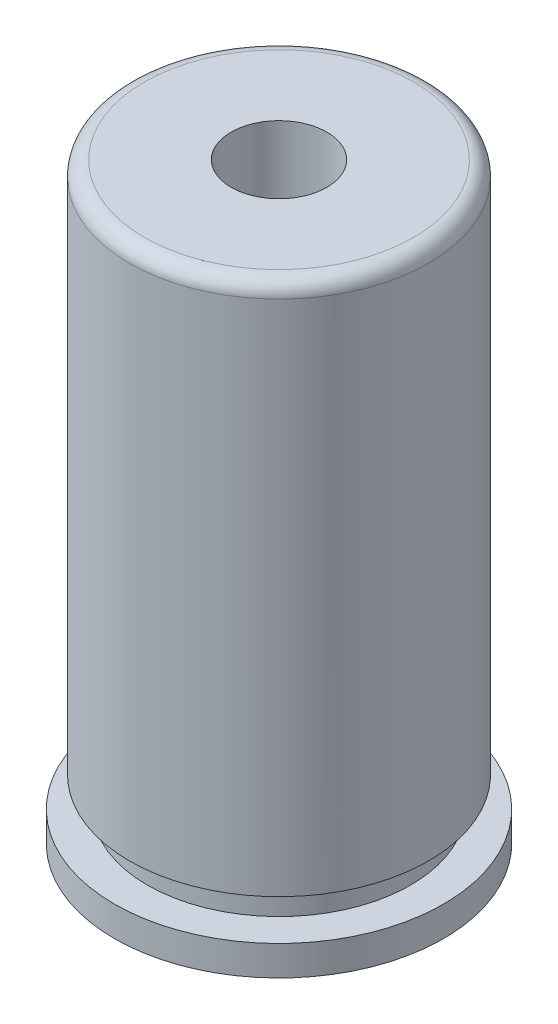
ISO-10303-21;
HEADER;
FILE_DESCRIPTION(('STEP AP214'),'2;1');
FILE_NAME('part.step','',(''),(''),'','','');
FILE_SCHEMA(('AUTOMOTIVE_DESIGN { 1 0 10303 214 1 1 1 1 }'));
ENDSEC;
DATA;
#1=APPLICATION_CONTEXT('core data for automotive mechanical design processes');
#2=APPLICATION_PROTOCOL_DEFINITION('international standard','automotive_design',2000,#1);
#3=PRODUCT_CONTEXT('',#1,'mechanical');
#4=PRODUCT('Part','Part','',(#3));
#5=PRODUCT_RELATED_PRODUCT_CATEGORY('part','',(#4));
#6=PRODUCT_DEFINITION_FORMATION('','',#4);
#7=PRODUCT_DEFINITION_CONTEXT('part definition',#1,'design');
#8=PRODUCT_DEFINITION('design','',#6,#7);
#9=PRODUCT_DEFINITION_SHAPE('','',#8);
#10=(LENGTH_UNIT() NAMED_UNIT(*) SI_UNIT(.MILLI.,.METRE.));
#11=(NAMED_UNIT(*) PLANE_ANGLE_UNIT() SI_UNIT($,.RADIAN.));
#12=(NAMED_UNIT(*) SI_UNIT($,.STERADIAN.) SOLID_ANGLE_UNIT());
#13=UNCERTAINTY_MEASURE_WITH_UNIT(LENGTH_MEASURE(1.E-05),#10,'distance_accuracy_value','');
#14=(GEOMETRIC_REPRESENTATION_CONTEXT(3) GLOBAL_UNCERTAINTY_ASSIGNED_CONTEXT((#13)) GLOBAL_UNIT_ASSIGNED_CONTEXT((#10,
#11,#12)) REPRESENTATION_CONTEXT('',''));
#15=CARTESIAN_POINT('',(0.,0.,0.));
#16=DIRECTION('',(0.,0.,1.));
#17=DIRECTION('',(1.,0.,0.));
#18=AXIS2_PLACEMENT_3D('',#15,#16,#17);
#19=CARTESIAN_POINT('',(0.,0.,0.));
#20=DIRECTION('',(0.,1.,0.));
#21=DIRECTION('',(0.,0.,1.));
#22=AXIS2_PLACEMENT_3D('',#19,#20,#21);
#23=PLANE('',#22);
#24=CARTESIAN_POINT('',(0.,0.,0.));
#25=DIRECTION('',(0.,-1.,0.));
#26=DIRECTION('',(0.,0.,-1.));
#27=AXIS2_PLACEMENT_3D('',#24,#25,#26);
#28=CIRCLE('',#27,2.75);
#29=CARTESIAN_POINT('',(0.,0.,-2.75));
#30=VERTEX_POINT('',#29);
#31=EDGE_CURVE('E132',#30,#30,#28,.F.);
#32=ORIENTED_EDGE('',*,*,#31,.F.);
#33=EDGE_LOOP('',(#32));
#34=FACE_BOUND('',#33,.T.);
#35=ADVANCED_FACE('F17',(#34),#23,.F.);
#36=CARTESIAN_POINT('',(0.,0.,0.));
#37=DIRECTION('',(0.,-1.,0.));
#38=DIRECTION('',(0.,0.,-1.));
#39=AXIS2_PLACEMENT_3D('',#36,#37,#38);
#40=CYLINDRICAL_SURFACE('',#39,2.75);
#41=CARTESIAN_POINT('',(0.,0.5,0.));
#42=DIRECTION('',(0.,-1.,0.));
#43=DIRECTION('',(0.,0.,-1.));
#44=AXIS2_PLACEMENT_3D('',#41,#42,#43);
#45=CIRCLE('',#44,2.75);
#46=CARTESIAN_POINT('',(0.,0.5,-2.75));
#47=VERTEX_POINT('',#46);
#48=EDGE_CURVE('E130',#47,#47,#45,.T.);
#49=ORIENTED_EDGE('',*,*,#48,.T.);
#50=EDGE_LOOP('',(#49));
#51=FACE_BOUND('',#50,.T.);
#52=ORIENTED_EDGE('',*,*,#31,.T.);
#53=EDGE_LOOP('',(#52));
#54=FACE_BOUND('',#53,.T.);
#55=ADVANCED_FACE('F92',(#51,#54),#40,.T.);
#56=CARTESIAN_POINT('',(0.,4.99999999999545,0.));
#57=DIRECTION('',(0.,1.,0.));
#58=DIRECTION('',(0.,0.,1.));
#59=AXIS2_PLACEMENT_3D('',#56,#57,#58);
#60=CONICAL_SURFACE('',#59,0.800000000026557,1.02974425866803);
#61=CARTESIAN_POINT('',(-8.5265128291212E-11,4.51931150479368,0.));
#62=VERTEX_POINT('',#61);
#63=VERTEX_LOOP('',#62);
#64=FACE_BOUND('',#63,.T.);
#65=CARTESIAN_POINT('',(0.,5.,0.));
#66=DIRECTION('',(0.,1.,0.));
#67=DIRECTION('',(0.,0.,1.));
#68=AXIS2_PLACEMENT_3D('',#65,#66,#67);
#69=CIRCLE('',#68,0.8);
#70=CARTESIAN_POINT('',(0.,5.,0.8));
#71=VERTEX_POINT('',#70);
#72=EDGE_CURVE('E129',#71,#71,#69,.T.);
#73=ORIENTED_EDGE('',*,*,#72,.T.);
#74=EDGE_LOOP('',(#73));
#75=FACE_BOUND('',#74,.T.);
#76=ADVANCED_FACE('F89',(#64,#75),#60,.F.);
#77=CARTESIAN_POINT('',(0.,0.5,0.));
#78=DIRECTION('',(0.,-1.,0.));
#79=DIRECTION('',(0.,0.,-1.));
#80=AXIS2_PLACEMENT_3D('',#77,#78,#79);
#81=PLANE('',#80);
#82=CARTESIAN_POINT('',(0.,0.5,0.));
#83=DIRECTION('',(0.,-1.,0.));
#84=DIRECTION('',(0.,0.,-1.));
#85=AXIS2_PLACEMENT_3D('',#82,#83,#84);
#86=CIRCLE('',#85,2.2);
#87=CARTESIAN_POINT('',(0.,0.5,-2.2));
#88=VERTEX_POINT('',#87);
#89=EDGE_CURVE('E120',#88,#88,#86,.F.);
#90=ORIENTED_EDGE('',*,*,#89,.F.);
#91=EDGE_LOOP('',(#90));
#92=FACE_BOUND('',#91,.T.);
#93=ORIENTED_EDGE('',*,*,#48,.F.);
#94=EDGE_LOOP('',(#93));
#95=FACE_BOUND('',#94,.T.);
#96=ADVANCED_FACE('F85',(#92,#95),#81,.F.);
#97=CARTESIAN_POINT('',(0.,4.245277080017,0.));
#98=DIRECTION('',(0.,1.,0.));
#99=DIRECTION('',(0.,0.,1.));
#100=AXIS2_PLACEMENT_3D('',#97,#98,#99);
#101=CYLINDRICAL_SURFACE('',#100,0.8);
#102=ORIENTED_EDGE('',*,*,#72,.F.);
#103=EDGE_LOOP('',(#102));
#104=FACE_BOUND('',#103,.T.);
#105=CARTESIAN_POINT('',(0.,9.9,0.));
#106=DIRECTION('',(0.,1.,0.));
#107=DIRECTION('',(0.,0.,1.));
#108=AXIS2_PLACEMENT_3D('',#105,#106,#107);
#109=CIRCLE('',#108,0.8);
#110=CARTESIAN_POINT('',(0.,9.9,0.8));
#111=VERTEX_POINT('',#110);
#112=EDGE_CURVE('E116',#111,#111,#109,.F.);
#113=ORIENTED_EDGE('',*,*,#112,.F.);
#114=EDGE_LOOP('',(#113));
#115=FACE_BOUND('',#114,.T.);
#116=ADVANCED_FACE('F81',(#104,#115),#101,.F.);
#117=CARTESIAN_POINT('',(0.,1.025,0.));
#118=DIRECTION('',(0.,-1.,0.));
#119=DIRECTION('',(0.,0.,-1.));
#120=AXIS2_PLACEMENT_3D('',#117,#118,#119);
#121=CYLINDRICAL_SURFACE('',#120,2.2);
#122=ORIENTED_EDGE('',*,*,#89,.T.);
#123=EDGE_LOOP('',(#122));
#124=FACE_BOUND('',#123,.T.);
#125=CARTESIAN_POINT('',(0.,1.,0.));
#126=DIRECTION('',(0.,-1.,0.));
#127=DIRECTION('',(0.,0.,-1.));
#128=AXIS2_PLACEMENT_3D('',#125,#126,#127);
#129=CIRCLE('',#128,2.2);
#130=CARTESIAN_POINT('',(0.,1.,-2.2));
#131=VERTEX_POINT('',#130);
#132=EDGE_CURVE('E53',#131,#131,#129,.F.);
#133=ORIENTED_EDGE('',*,*,#132,.F.);
#134=EDGE_LOOP('',(#133));
#135=FACE_BOUND('',#134,.T.);
#136=ADVANCED_FACE('F76',(#124,#135),#121,.T.);
#137=CARTESIAN_POINT('',(0.,9.9,0.));
#138=DIRECTION('',(0.,1.,0.));
#139=DIRECTION('',(0.,0.,1.));
#140=AXIS2_PLACEMENT_3D('',#137,#138,#139);
#141=PLANE('',#140);
#142=ORIENTED_EDGE('',*,*,#112,.T.);
#143=EDGE_LOOP('',(#142));
#144=FACE_BOUND('',#143,.T.);
#145=DIRECTION('',(0.00363438807219677,0.,0.999993395589861));
#146=VECTOR('',#145,1.);
#147=CARTESIAN_POINT('',(-2.25,9.9,-3.47998179251E-13));
#148=LINE('',#147,#146);
#149=CARTESIAN_POINT('',(-2.25000000000001,9.9,-3.48295792180524E-13));
#150=VERTEX_POINT('',#149);
#151=CARTESIAN_POINT('',(-2.24994056050499,9.9,0.0163546383203));
#152=VERTEX_POINT('',#151);
#153=EDGE_CURVE('E36',#150,#152,#148,.T.);
#154=ORIENTED_EDGE('',*,*,#153,.T.);
#155=CARTESIAN_POINT('',(0.,9.9,0.));
#156=DIRECTION('',(0.,-1.,0.));
#157=DIRECTION('',(1.,0.,0.));
#158=AXIS2_PLACEMENT_3D('',#155,#156,#157);
#159=CIRCLE('',#158,2.25);
#160=CARTESIAN_POINT('',(2.25000000000001,9.9,-1.1004876805838E-12));
#161=VERTEX_POINT('',#160);
#162=EDGE_CURVE('E49',#161,#152,#159,.T.);
#163=ORIENTED_EDGE('',*,*,#162,.F.);
#164=DIRECTION('',(-0.00363438807447646,0.,-0.999993395589853));
#165=VECTOR('',#164,1.);
#166=CARTESIAN_POINT('',(2.25000000000003,9.9,-1.83400590179038E-12));
#167=LINE('',#166,#165);
#168=CARTESIAN_POINT('',(2.24994056050499,9.9,-0.0163546383199796));
#169=VERTEX_POINT('',#168);
#170=EDGE_CURVE('E45',#169,#161,#167,.F.);
#171=ORIENTED_EDGE('',*,*,#170,.F.);
#172=CARTESIAN_POINT('',(-2.25,9.9,-3.48476130763997E-13));
#173=CARTESIAN_POINT('',(-2.25000048317092,9.9,-0.0326492272856265));
#174=CARTESIAN_POINT('',(-2.24928937009127,9.9,-0.0652984181167297));
#175=CARTESIAN_POINT('',(-2.24644742038312,9.9,-0.13053495691154));
#176=CARTESIAN_POINT('',(-2.24431658375462,9.9,-0.163122304875247));
#177=CARTESIAN_POINT('',(-2.23863865590101,9.9,-0.228173387976218));
#178=CARTESIAN_POINT('',(-2.23509156467591,9.9,-0.260637123113482));
#179=CARTESIAN_POINT('',(-2.22658800083633,9.9,-0.325379476216697));
#180=CARTESIAN_POINT('',(-2.22163152822186,9.9,-0.357658094182648));
#181=CARTESIAN_POINT('',(-2.21031855211421,9.9,-0.421969050938067));
#182=CARTESIAN_POINT('',(-2.20396204862104,9.9,-0.454001389727535));
#183=CARTESIAN_POINT('',(-2.18986106573916,9.9,-0.517759095018617));
#184=CARTESIAN_POINT('',(-2.18211658635044,9.9,-0.54948446152023));
#185=CARTESIAN_POINT('',(-2.16525432267618,9.9,-0.61256811016018));
#186=CARTESIAN_POINT('',(-2.15613653839062,9.9,-0.643926392298516));
#187=CARTESIAN_POINT('',(-2.13654494171551,9.9,-0.706216455830464));
#188=CARTESIAN_POINT('',(-2.12607112932594,9.9,-0.737148237224077));
#189=CARTESIAN_POINT('',(-2.10378732160359,9.9,-0.798526690975241));
#190=CARTESIAN_POINT('',(-2.09197732627081,9.9,-0.828973363332794));
#191=CARTESIAN_POINT('',(-2.06704352977555,9.9,-0.889323909833712));
#192=CARTESIAN_POINT('',(-2.05391972861307,9.9,-0.919227783977078));
#193=CARTESIAN_POINT('',(-2.02638318706986,9.9,-0.978436073577626));
#194=CARTESIAN_POINT('',(-2.01197044668913,9.90000000000001,-1.00774048903481));
#195=CARTESIAN_POINT('',(-1.98188333473821,9.89999999999999,-1.06569433573749));
#196=CARTESIAN_POINT('',(-1.96620896316803,9.89999999999997,-1.09434376698299));
#197=CARTESIAN_POINT('',(-1.93362829045495,9.90000000000003,-1.15093336407551));
#198=CARTESIAN_POINT('',(-1.91672198931206,9.90000000000012,-1.17887352992253));
#199=CARTESIAN_POINT('',(-1.88170948169421,9.89999999999988,-1.23399164659877));
#200=CARTESIAN_POINT('',(-1.86360327521927,9.89999999999954,-1.26116959742798));
#201=CARTESIAN_POINT('',(-1.8262252979572,9.90000000000046,-1.31471182464302));
#202=CARTESIAN_POINT('',(-1.80695352717007,9.90000000000173,-1.34107610102885));
#203=CARTESIAN_POINT('',(-1.76728080936732,9.89999999999828,-1.39294089005171));
#204=CARTESIAN_POINT('',(-1.74687986235171,9.89999999999356,-1.41844140268874));
#205=CARTESIAN_POINT('',(-1.70498792204875,9.90000000000644,-1.46853085194384));
#206=CARTESIAN_POINT('',(-1.68349692876141,9.90000000002404,-1.4931197885619));
#207=CARTESIAN_POINT('',(-1.63946384322679,9.89999999997596,-1.54133761068225));
#208=CARTESIAN_POINT('',(-1.61692175097951,9.89999999991028,-1.56496649618455));
#209=CARTESIAN_POINT('',(-1.56990084188075,9.90000000009336,-1.6121649646274));
#210=CARTESIAN_POINT('',(-1.54538055423308,9.90000000035498,-1.63569324165642));
#211=CARTESIAN_POINT('',(-1.49531218423549,9.89999999730366,-1.68162844330629));
#212=CARTESIAN_POINT('',(-1.46976412177603,9.89999999399078,-1.70403538960938));
#213=CARTESIAN_POINT('',(-1.41768973665806,9.89999996854687,-1.74768189605388));
#214=CARTESIAN_POINT('',(-1.39116341166769,9.8999999464158,-1.76892145341232));
#215=CARTESIAN_POINT('',(-1.33718331557641,9.89999986393024,-1.81019069352632));
#216=CARTESIAN_POINT('',(-1.30972952213122,9.89999980357483,-1.83022034710079));
#217=CARTESIAN_POINT('',(-1.26790053911124,9.89999964865999,-1.85933001900132));
#218=CARTESIAN_POINT('',(-1.25384881729521,9.89999958628696,-1.86887787022889));
#219=CARTESIAN_POINT('',(-1.22554187860958,9.89999945364849,-1.88764195442793));
#220=CARTESIAN_POINT('',(-1.21128683445416,9.89999938338944,-1.89685844787783));
#221=CARTESIAN_POINT('',(-1.16820588308211,9.89999921081405,-1.92400280102149));
#222=CARTESIAN_POINT('',(-1.13906076638926,9.89999914667309,-1.94142789823445));
#223=CARTESIAN_POINT('',(-1.079992427019,9.89999914736752,-1.97489176917993));
#224=CARTESIAN_POINT('',(-1.05006930085081,9.89999921218699,-1.99093071380234));
#225=CARTESIAN_POINT('',(-0.989521550398068,9.89999944005417,-2.0216144708377));
#226=CARTESIAN_POINT('',(-0.958897057557703,9.89999960308362,-2.03625954186861));
#227=CARTESIAN_POINT('',(-0.896972225064212,9.89999987046543,-2.06401848815991));
#228=CARTESIAN_POINT('',(-0.865672055146569,9.89999997483237,-2.07713274278965));
#229=CARTESIAN_POINT('',(-0.818567507763683,9.90000001243667,-2.09585799990067));
#230=CARTESIAN_POINT('',(-0.802933748037803,9.90000000553386,-2.10190881134197));
#231=CARTESIAN_POINT('',(-0.736525353137544,9.89999998212423,-2.12677228687958));
#232=CARTESIAN_POINT('',(-0.68512103089212,9.89999997852097,-2.1439581859812));
#233=CARTESIAN_POINT('',(-0.607602781893747,9.89999991157387,-2.16679466907804));
#234=CARTESIAN_POINT('',(-0.581896217285071,9.89999987948286,-2.17387248900176));
#235=CARTESIAN_POINT('',(-0.52652534901868,9.89999981416395,-2.18805341054585));
#236=CARTESIAN_POINT('',(-0.496823845439694,9.89999978143698,-2.19501358391592));
#237=CARTESIAN_POINT('',(-0.45419516749047,9.89999975408451,-2.20407723742747));
#238=CARTESIAN_POINT('',(-0.441372896895457,9.89999974837344,-2.20668474299397));
#239=CARTESIAN_POINT('',(-0.413148871658883,9.89999974179589,-2.21216419222843));
#240=CARTESIAN_POINT('',(-0.397737498011087,9.89999974210806,-2.21498675187275));
#241=CARTESIAN_POINT('',(-0.351420477830946,9.89999974951087,-2.22296609748112));
#242=CARTESIAN_POINT('',(-0.320429396343947,9.89999976306677,-2.22763509784));
#243=CARTESIAN_POINT('',(-0.258280338967328,9.89999980570779,-2.23566027334767));
#244=CARTESIAN_POINT('',(-0.227122371642993,9.89999983479214,-2.23901651523053));
#245=CARTESIAN_POINT('',(-0.164694489648994,9.89999989667376,-2.24441338158097));
#246=CARTESIAN_POINT('',(-0.1334245827971,9.8999999294708,-2.24645409618853));
#247=CARTESIAN_POINT('',(-0.0708292610805756,9.89999998094143,-2.24920762017406));
#248=CARTESIAN_POINT('',(-0.0395038512339857,9.89999999961624,-2.2499205440219));
#249=CARTESIAN_POINT('',(0.0231927499933121,9.9000000003843,-2.25004982612982));
#250=CARTESIAN_POINT('',(0.0545639443526553,9.89999998242653,-2.24946437658769));
#251=CARTESIAN_POINT('',(0.117253395584025,9.89999996496662,-2.24702476505615));
#252=CARTESIAN_POINT('',(0.148571657763425,9.8999999654625,-2.24517073888691));
#253=CARTESIAN_POINT('',(0.211105668535629,9.89999997817902,-2.24019387059116));
#254=CARTESIAN_POINT('',(0.242321422819493,9.899999990399,-2.23707110014606));
#255=CARTESIAN_POINT('',(0.304598081793755,9.90000000901992,-2.22954530535433));
#256=CARTESIAN_POINT('',(0.335658987401688,9.9000000154209,-2.22514228860281));
#257=CARTESIAN_POINT('',(0.382103801278697,9.89999986589129,-2.21763556793059));
#258=CARTESIAN_POINT('',(0.397561587587034,9.89999978952011,-2.21498283956499));
#259=CARTESIAN_POINT('',(0.419342394166421,9.89999972997769,-2.21096166806931));
#260=CARTESIAN_POINT('',(0.425695205704115,9.89999971841089,-2.20975462415911));
#261=CARTESIAN_POINT('',(0.460103415669045,9.89999967916264,-2.20304821809937));
#262=CARTESIAN_POINT('',(0.488052019006592,9.89999973173023,-2.1969916823254));
#263=CARTESIAN_POINT('',(0.550071585220125,9.89999982974264,-2.18231252755275));
#264=CARTESIAN_POINT('',(0.584078134179997,9.89999987079599,-2.17341991067927));
#265=CARTESIAN_POINT('',(0.665604761843736,9.89999995218544,-2.15003766911304));
#266=CARTESIAN_POINT('',(0.712901107143262,9.89999998521255,-2.13475380812213));
#267=CARTESIAN_POINT('',(0.779503806114091,9.89999999969525,-2.11079206182832));
#268=CARTESIAN_POINT('',(0.79927140388959,9.89999999988264,-2.10336715806694));
#269=CARTESIAN_POINT('',(0.850572066237037,9.90000000018883,-2.08329383795548));
#270=CARTESIAN_POINT('',(0.881939750768658,9.90000000019639,-2.07021778602602));
#271=CARTESIAN_POINT('',(0.944054057749899,9.89999999965762,-2.04267114464264));
#272=CARTESIAN_POINT('',(0.974800701500047,9.89999999911132,-2.02820060311564));
#273=CARTESIAN_POINT('',(1.03561723169536,9.89999998064549,-1.99790176288302));
#274=CARTESIAN_POINT('',(1.06568712340266,9.8999999627261,-1.98207347473926));
#275=CARTESIAN_POINT('',(1.12508965257116,9.89999988471505,-1.94908571317375));
#276=CARTESIAN_POINT('',(1.15442227616333,9.8999998246226,-1.93192621473487));
#277=CARTESIAN_POINT('',(1.19782526956974,9.89999965788848,-1.90522191717054));
#278=CARTESIAN_POINT('',(1.21219426586837,9.89999958953956,-1.89615919833053));
#279=CARTESIAN_POINT('',(1.24071026112407,9.89999944125768,-1.87771423297948));
#280=CARTESIAN_POINT('',(1.25485742061064,9.89999936133356,-1.86833223472902));
#281=CARTESIAN_POINT('',(1.29696116967555,9.89999916197635,-1.83969352407774));
#282=CARTESIAN_POINT('',(1.32458362512018,9.89999908292854,-1.81994188943174));
#283=CARTESIAN_POINT('',(1.37886613091595,9.89999906942181,-1.77916838958903));
#284=CARTESIAN_POINT('',(1.40552630609858,9.89999913494407,-1.75814669010397));
#285=CARTESIAN_POINT('',(1.45784700940517,9.89999938002602,-1.71490129125374));
#286=CARTESIAN_POINT('',(1.48350773367861,9.89999955956322,-1.69267782980875));
#287=CARTESIAN_POINT('',(1.53368955851094,9.89999985438638,-1.64699446172724));
#288=CARTESIAN_POINT('',(1.55821095850716,9.89999996968931,-1.62353488346585));
#289=CARTESIAN_POINT('',(1.59539149180522,9.90000001648589,-1.58664366012136));
#290=CARTESIAN_POINT('',(1.60835985214684,9.90000000782905,-1.57351854253456));
#291=CARTESIAN_POINT('',(1.66171336743274,9.89999997492438,-1.51819517841502));
#292=CARTESIAN_POINT('',(1.70066389861639,9.89999995750337,-1.47458013189377));
#293=CARTESIAN_POINT('',(1.75613213531733,9.89999982699339,-1.40736525413057));
#294=CARTESIAN_POINT('',(1.77399341919444,9.89999976700323,-1.38485397089864));
#295=CARTESIAN_POINT('',(1.81143887017278,9.89999964504866,-1.33573325120822));
#296=CARTESIAN_POINT('',(1.83088098912975,9.89999958413173,-1.30901457580884));
#297=CARTESIAN_POINT('',(1.8578369004987,9.89999953474574,-1.2701639347763));
#298=CARTESIAN_POINT('',(1.86584876031578,9.89999952477806,-1.25837414114488));
#299=CARTESIAN_POINT('',(1.88314800918335,9.89999951418207,-1.23237965286119));
#300=CARTESIAN_POINT('',(1.89238744187087,9.89999951569606,-1.21814299890235));
#301=CARTESIAN_POINT('',(1.91961302733785,9.89999953199198,-1.17512345624825));
#302=CARTESIAN_POINT('',(1.93710856169545,9.89999955852562,-1.14602798997952));
#303=CARTESIAN_POINT('',(1.97074694485306,9.89999963959903,-1.08706972688589));
#304=CARTESIAN_POINT('',(1.98688989619793,9.89999969413667,-1.05720698845574));
#305=CARTESIAN_POINT('',(2.01779342231228,9.89999980933649,-0.996777878146008));
#306=CARTESIAN_POINT('',(2.03255413450347,9.89999986999806,-0.966211576591648));
#307=CARTESIAN_POINT('',(2.06065161226549,9.89999996503706,-0.904435987887094));
#308=CARTESIAN_POINT('',(2.07398855300149,9.89999999941773,-0.873226780397885));
#309=CARTESIAN_POINT('',(2.09829421684505,9.90000000053817,-0.812628751695591));
#310=CARTESIAN_POINT('',(2.10936579841857,9.89999997220343,-0.783281067969421));
#311=CARTESIAN_POINT('',(2.13031778461045,9.89999993903964,-0.724167743511035));
#312=CARTESIAN_POINT('',(2.14019833781603,9.89999993420767,-0.694402155433004));
#313=CARTESIAN_POINT('',(2.15874948957901,9.89999994931028,-0.634498156443931));
#314=CARTESIAN_POINT('',(2.167420168551,9.89999996924321,-0.604359770456084));
#315=CARTESIAN_POINT('',(2.18351832358943,9.90000001382842,-0.543753148910294));
#316=CARTESIAN_POINT('',(2.19094580973556,9.90000003848065,-0.513284916028854));
#317=CARTESIAN_POINT('',(2.20119125262208,9.89999989650341,-0.467462296349088));
#318=CARTESIAN_POINT('',(2.20445020728196,9.89999981975672,-0.452205556188854));
#319=CARTESIAN_POINT('',(2.20869749144749,9.89999976562393,-0.430972699009231));
#320=CARTESIAN_POINT('',(2.20985494608716,9.89999975617456,-0.425030480749187));
#321=CARTESIAN_POINT('',(2.21631669376825,9.89999972232362,-0.39105688492677));
#322=CARTESIAN_POINT('',(2.22106346405378,9.89999977264771,-0.362918365985832));
#323=CARTESIAN_POINT('',(2.23053060524933,9.89999986250299,-0.29950145357054));
#324=CARTESIAN_POINT('',(2.23495412312379,9.89999989628704,-0.264178315664728));
#325=CARTESIAN_POINT('',(2.23969865313712,9.89999993678611,-0.217222949193906));
#326=CARTESIAN_POINT('',(2.2407757465228,9.89999994640324,-0.205663193656327));
#327=CARTESIAN_POINT('',(2.244893580675,9.89999998063975,-0.157452150031917));
#328=CARTESIAN_POINT('',(2.24712988902653,9.89999999259079,-0.120726979412226));
#329=CARTESIAN_POINT('',(2.24928563077197,9.89999999994779,-0.0616096094676784));
#330=CARTESIAN_POINT('',(2.24976937895807,9.89999999999966,-0.0392355689184901));
#331=CARTESIAN_POINT('',(2.24993809396485,9.9,-0.0166914037219588));
#332=CARTESIAN_POINT('',(2.2499393361873,9.9,-0.0165230210683922));
#333=CARTESIAN_POINT('',(2.249940560505,9.9,-0.0163546383199796));
#334=B_SPLINE_CURVE_WITH_KNOTS('',3,(#172,#173,#174,#175,#176,#177,#178,#179,#180,#181,#182,
#183,#184,#185,#186,#187,#188,#189,#190,#191,#192,#193,#194,#195,#196,#197,#198,#199,#200,#201,
#202,#203,#204,#205,#206,#207,#208,#209,#210,#211,#212,#213,#214,#215,#216,#217,#218,#219,#220,
#221,#222,#223,#224,#225,#226,#227,#228,#229,#230,#231,#232,#233,#234,#235,#236,#237,#238,#239,
#240,#241,#242,#243,#244,#245,#246,#247,#248,#249,#250,#251,#252,#253,#254,#255,#256,#257,#258,
#259,#260,#261,#262,#263,#264,#265,#266,#267,#268,#269,#270,#271,#272,#273,#274,#275,#276,#277,
#278,#279,#280,#281,#282,#283,#284,#285,#286,#287,#288,#289,#290,#291,#292,#293,#294,#295,#296,
#297,#298,#299,#300,#301,#302,#303,#304,#305,#306,#307,#308,#309,#310,#311,#312,#313,#314,#315,
#316,#317,#318,#319,#320,#321,#322,#323,#324,#325,#326,#327,#328,#329,#330,#331,#332,#333),
.UNSPECIFIED.,.F.,.F.,(4,2,2,2,2,2,2,2,2,2,2,2,2,2,2,2,2,2,2,2,2,2,2,2,2,2,2,2,2,2,2,2,2,2,2,2,
2,2,2,2,2,2,2,2,2,2,2,2,2,2,2,2,2,2,2,2,2,2,2,2,2,2,2,2,2,2,2,2,2,2,2,2,2,2,2,2,2,2,2,2,4),(0.,
0.0979398868313483,0.195879773662696,0.293819660494042,0.39175954732539,0.489699434156739,
0.587639320988085,0.685579207819432,0.783519094650781,0.881458981482129,0.979398868313476,
1.07733875514482,1.17527864197617,1.27321852880752,1.37115841563887,1.46909830247022,
1.56703818930156,1.66497807613291,1.76291796296426,1.86483169888433,1.96674346342086,
2.0686554708964,2.17056993535807,2.2215319795085,2.27245304546459,2.37428278827869,
2.47609995919255,2.57789820206857,2.67967116333928,2.72996262014571,2.89238852473273,
2.9723667721798,3.06385406368258,3.10310671283977,3.1501067091477,3.24409892548019,
3.33808636309812,3.43206736000752,3.52604025436625,3.6201440748907,3.71423782176419,
3.80832625327481,3.90241412661359,3.94946176847368,3.9688609382901,4.05462721760905,
4.16004400726822,4.30902942836611,4.37237280497438,4.47428778462107,4.57619926282016,
4.67810994832439,4.78002254947639,4.83098359829531,4.88190588844224,4.98373782636571,
5.08555650634578,5.18735510193453,5.28912678968608,5.34448007768999,5.51968548643888,
5.6058807503661,5.70497208922776,5.74773346771738,5.7986455137191,5.90045864817349,
6.00226405675993,6.10405933312059,6.20584207124265,6.29991646966912,6.39397911963442,
6.48803551472224,6.58209114717223,6.62889028451684,6.64705173979039,6.73263702970954,
6.83938845809013,6.87421758030172,6.98454388121447,7.05167309467154,7.05217825637481),.UNSPECIFIED.);
#335=EDGE_CURVE('E51',#150,#169,#334,.T.);
#336=ORIENTED_EDGE('',*,*,#335,.F.);
#337=EDGE_LOOP('',(#154,#163,#171,#336));
#338=FACE_BOUND('',#337,.T.);
#339=ADVANCED_FACE('F56',(#144,#338),#141,.T.);
#340=CARTESIAN_POINT('',(0.,1.,0.));
#341=DIRECTION('',(0.,-1.,0.));
#342=DIRECTION('',(0.,0.,-1.));
#343=AXIS2_PLACEMENT_3D('',#340,#341,#342);
#344=PLANE('',#343);
#345=ORIENTED_EDGE('',*,*,#132,.T.);
#346=EDGE_LOOP('',(#345));
#347=FACE_BOUND('',#346,.T.);
#348=CARTESIAN_POINT('',(0.,1.,0.));
#349=DIRECTION('',(0.,1.,0.));
#350=DIRECTION('',(0.,0.,1.));
#351=AXIS2_PLACEMENT_3D('',#348,#349,#350);
#352=CIRCLE('',#351,2.5);
#353=CARTESIAN_POINT('',(0.,1.,2.5));
#354=VERTEX_POINT('',#353);
#355=EDGE_CURVE('E28',#354,#354,#352,.T.);
#356=ORIENTED_EDGE('',*,*,#355,.F.);
#357=EDGE_LOOP('',(#356));
#358=FACE_BOUND('',#357,.T.);
#359=ADVANCED_FACE('F75',(#347,#358),#344,.T.);
#360=CARTESIAN_POINT('',(0.,9.65,0.));
#361=DIRECTION('',(0.,1.,0.));
#362=DIRECTION('',(0.999971925295504,0.,-0.00749323833889503));
#363=AXIS2_PLACEMENT_3D('',#360,#361,#362);
#364=TOROIDAL_SURFACE('',#363,2.25,0.25);
#365=ORIENTED_EDGE('',*,*,#170,.T.);
#366=ORIENTED_EDGE('',*,*,#162,.T.);
#367=ORIENTED_EDGE('',*,*,#153,.F.);
#368=ORIENTED_EDGE('',*,*,#335,.T.);
#369=EDGE_LOOP('',(#365,#366,#367,#368));
#370=FACE_BOUND('',#369,.T.);
#371=CARTESIAN_POINT('',(0.,9.65,0.));
#372=DIRECTION('',(0.,1.,0.));
#373=DIRECTION('',(0.,0.,1.));
#374=AXIS2_PLACEMENT_3D('',#371,#372,#373);
#375=CIRCLE('',#374,2.5);
#376=CARTESIAN_POINT('',(0.,9.65,2.5));
#377=VERTEX_POINT('',#376);
#378=EDGE_CURVE('E11',#377,#377,#375,.F.);
#379=ORIENTED_EDGE('',*,*,#378,.F.);
#380=EDGE_LOOP('',(#379));
#381=FACE_BOUND('',#380,.T.);
#382=ADVANCED_FACE('F47',(#370,#381),#364,.T.);
#383=CARTESIAN_POINT('',(0.,0.,0.));
#384=DIRECTION('',(0.,1.,0.));
#385=DIRECTION('',(0.,0.,1.));
#386=AXIS2_PLACEMENT_3D('',#383,#384,#385);
#387=CYLINDRICAL_SURFACE('',#386,2.5);
#388=ORIENTED_EDGE('',*,*,#355,.T.);
#389=EDGE_LOOP('',(#388));
#390=FACE_BOUND('',#389,.T.);
#391=ORIENTED_EDGE('',*,*,#378,.T.);
#392=EDGE_LOOP('',(#391));
#393=FACE_BOUND('',#392,.T.);
#394=ADVANCED_FACE('F103',(#390,#393),#387,.T.);
#395=CLOSED_SHELL('',(#35,#55,#76,#96,#116,#136,#339,#359,#382,#394));
#396=MANIFOLD_SOLID_BREP('B1',#395);
#397=ADVANCED_BREP_SHAPE_REPRESENTATION('',(#18,#396),#14);
#398=SHAPE_DEFINITION_REPRESENTATION(#9,#397);
ENDSEC;
END-ISO-10303-21;
